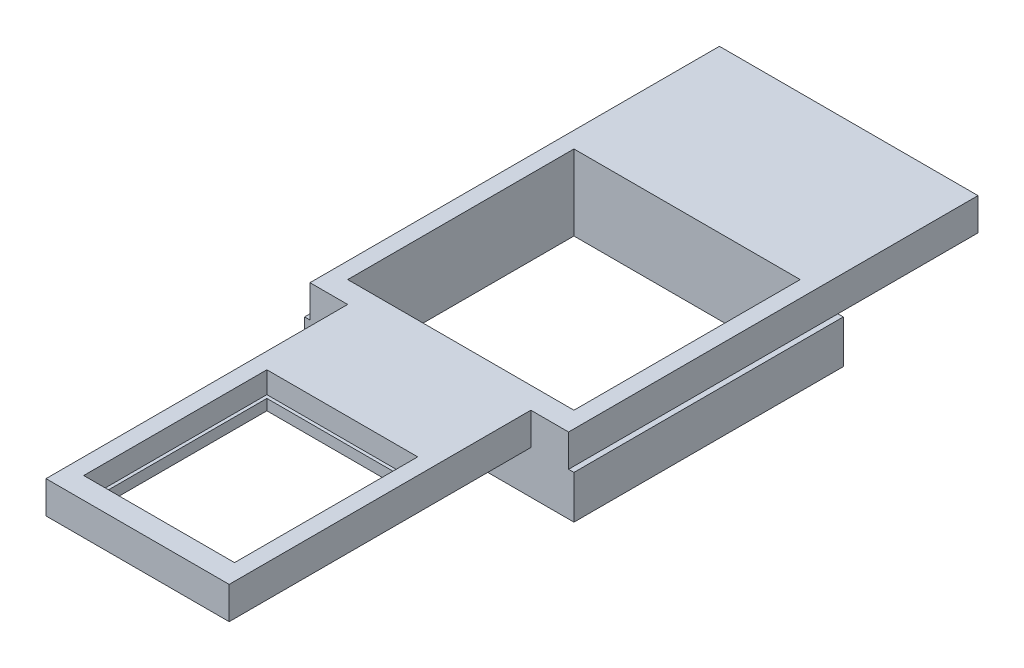
ISO-10303-21;
HEADER;
FILE_DESCRIPTION(('STEP AP214'),'2;1');
FILE_NAME('part.step','',(''),(''),'','','');
FILE_SCHEMA(('AUTOMOTIVE_DESIGN { 1 0 10303 214 1 1 1 1 }'));
ENDSEC;
DATA;
#1=APPLICATION_CONTEXT('core data for automotive mechanical design processes');
#2=APPLICATION_PROTOCOL_DEFINITION('international standard','automotive_design',2000,#1);
#3=PRODUCT_CONTEXT('',#1,'mechanical');
#4=PRODUCT('Part','Part','',(#3));
#5=PRODUCT_RELATED_PRODUCT_CATEGORY('part','',(#4));
#6=PRODUCT_DEFINITION_FORMATION('','',#4);
#7=PRODUCT_DEFINITION_CONTEXT('part definition',#1,'design');
#8=PRODUCT_DEFINITION('design','',#6,#7);
#9=PRODUCT_DEFINITION_SHAPE('','',#8);
#10=(LENGTH_UNIT() NAMED_UNIT(*) SI_UNIT(.MILLI.,.METRE.));
#11=(NAMED_UNIT(*) PLANE_ANGLE_UNIT() SI_UNIT($,.RADIAN.));
#12=(NAMED_UNIT(*) SI_UNIT($,.STERADIAN.) SOLID_ANGLE_UNIT());
#13=UNCERTAINTY_MEASURE_WITH_UNIT(LENGTH_MEASURE(1.E-05),#10,'distance_accuracy_value','');
#14=(GEOMETRIC_REPRESENTATION_CONTEXT(3) GLOBAL_UNCERTAINTY_ASSIGNED_CONTEXT((#13)) GLOBAL_UNIT_ASSIGNED_CONTEXT((#10,
#11,#12)) REPRESENTATION_CONTEXT('',''));
#15=CARTESIAN_POINT('',(0.,0.,0.));
#16=DIRECTION('',(0.,0.,1.));
#17=DIRECTION('',(1.,0.,0.));
#18=AXIS2_PLACEMENT_3D('',#15,#16,#17);
#19=CARTESIAN_POINT('',(-7.,-0.00100000000000013,21.5));
#20=DIRECTION('',(-1.,0.,0.));
#21=DIRECTION('',(0.,0.,1.));
#22=AXIS2_PLACEMENT_3D('',#19,#20,#21);
#23=PLANE('',#22);
#24=DIRECTION('',(0.,0.,-1.));
#25=VECTOR('',#24,1.);
#26=CARTESIAN_POINT('',(-7.,5.,38.5));
#27=LINE('',#26,#25);
#28=CARTESIAN_POINT('',(-7.,5.,38.5));
#29=VERTEX_POINT('',#28);
#30=CARTESIAN_POINT('',(-7.,5.,21.5));
#31=VERTEX_POINT('',#30);
#32=EDGE_CURVE('E52',#29,#31,#27,.T.);
#33=ORIENTED_EDGE('',*,*,#32,.T.);
#34=DIRECTION('',(0.,1.,0.));
#35=VECTOR('',#34,1.);
#36=CARTESIAN_POINT('',(-7.,-0.00100000000000013,21.5));
#37=LINE('',#36,#35);
#38=CARTESIAN_POINT('',(-7.,7.,21.5));
#39=VERTEX_POINT('',#38);
#40=EDGE_CURVE('E382',#31,#39,#37,.T.);
#41=ORIENTED_EDGE('',*,*,#40,.T.);
#42=DIRECTION('',(0.,0.,1.));
#43=VECTOR('',#42,1.);
#44=CARTESIAN_POINT('',(-7.,7.,21.5));
#45=LINE('',#44,#43);
#46=CARTESIAN_POINT('',(-7.,7.,38.5));
#47=VERTEX_POINT('',#46);
#48=EDGE_CURVE('E361',#39,#47,#45,.T.);
#49=ORIENTED_EDGE('',*,*,#48,.T.);
#50=DIRECTION('',(0.,1.,0.));
#51=VECTOR('',#50,1.);
#52=CARTESIAN_POINT('',(-7.,-0.00100000000000013,38.5));
#53=LINE('',#52,#51);
#54=EDGE_CURVE('E381',#29,#47,#53,.T.);
#55=ORIENTED_EDGE('',*,*,#54,.F.);
#56=EDGE_LOOP('',(#33,#41,#49,#55));
#57=FACE_BOUND('',#56,.T.);
#58=ADVANCED_FACE('F35',(#57),#23,.F.);
#59=CARTESIAN_POINT('',(-7.,-0.00100000000000013,21.5));
#60=DIRECTION('',(0.,0.,-1.));
#61=DIRECTION('',(-1.,0.,0.));
#62=AXIS2_PLACEMENT_3D('',#59,#60,#61);
#63=PLANE('',#62);
#64=DIRECTION('',(1.,0.,0.));
#65=VECTOR('',#64,1.);
#66=CARTESIAN_POINT('',(-7.,5.,21.5));
#67=LINE('',#66,#65);
#68=CARTESIAN_POINT('',(7.,5.,21.5));
#69=VERTEX_POINT('',#68);
#70=EDGE_CURVE('E59',#31,#69,#67,.T.);
#71=ORIENTED_EDGE('',*,*,#70,.T.);
#72=DIRECTION('',(0.,1.,0.));
#73=VECTOR('',#72,1.);
#74=CARTESIAN_POINT('',(7.,-0.00100000000000013,21.5));
#75=LINE('',#74,#73);
#76=CARTESIAN_POINT('',(7.,7.,21.5));
#77=VERTEX_POINT('',#76);
#78=EDGE_CURVE('E385',#69,#77,#75,.T.);
#79=ORIENTED_EDGE('',*,*,#78,.T.);
#80=DIRECTION('',(-1.,0.,0.));
#81=VECTOR('',#80,1.);
#82=CARTESIAN_POINT('',(-7.,7.,21.5));
#83=LINE('',#82,#81);
#84=EDGE_CURVE('E378',#77,#39,#83,.T.);
#85=ORIENTED_EDGE('',*,*,#84,.T.);
#86=ORIENTED_EDGE('',*,*,#40,.F.);
#87=EDGE_LOOP('',(#71,#79,#85,#86));
#88=FACE_BOUND('',#87,.T.);
#89=ADVANCED_FACE('F618',(#88),#63,.F.);
#90=CARTESIAN_POINT('',(7.,-0.00100000000000013,21.5));
#91=DIRECTION('',(1.,0.,0.));
#92=DIRECTION('',(0.,0.,-1.));
#93=AXIS2_PLACEMENT_3D('',#90,#91,#92);
#94=PLANE('',#93);
#95=DIRECTION('',(0.,0.,1.));
#96=VECTOR('',#95,1.);
#97=CARTESIAN_POINT('',(7.,5.,21.5));
#98=LINE('',#97,#96);
#99=CARTESIAN_POINT('',(7.,5.,38.5));
#100=VERTEX_POINT('',#99);
#101=EDGE_CURVE('E300',#69,#100,#98,.T.);
#102=ORIENTED_EDGE('',*,*,#101,.T.);
#103=DIRECTION('',(0.,1.,0.));
#104=VECTOR('',#103,1.);
#105=CARTESIAN_POINT('',(7.,-0.00100000000000013,38.5));
#106=LINE('',#105,#104);
#107=CARTESIAN_POINT('',(7.,7.,38.5));
#108=VERTEX_POINT('',#107);
#109=EDGE_CURVE('E387',#100,#108,#106,.T.);
#110=ORIENTED_EDGE('',*,*,#109,.T.);
#111=DIRECTION('',(0.,0.,-1.));
#112=VECTOR('',#111,1.);
#113=CARTESIAN_POINT('',(7.,7.,21.5));
#114=LINE('',#113,#112);
#115=EDGE_CURVE('E375',#108,#77,#114,.T.);
#116=ORIENTED_EDGE('',*,*,#115,.T.);
#117=ORIENTED_EDGE('',*,*,#78,.F.);
#118=EDGE_LOOP('',(#102,#110,#116,#117));
#119=FACE_BOUND('',#118,.T.);
#120=ADVANCED_FACE('F623',(#119),#94,.F.);
#121=CARTESIAN_POINT('',(-7.,-0.00100000000000013,38.5));
#122=DIRECTION('',(0.,0.,1.));
#123=DIRECTION('',(1.,0.,0.));
#124=AXIS2_PLACEMENT_3D('',#121,#122,#123);
#125=PLANE('',#124);
#126=DIRECTION('',(-1.,0.,0.));
#127=VECTOR('',#126,1.);
#128=CARTESIAN_POINT('',(7.,5.,38.5));
#129=LINE('',#128,#127);
#130=EDGE_CURVE('E293',#100,#29,#129,.T.);
#131=ORIENTED_EDGE('',*,*,#130,.T.);
#132=ORIENTED_EDGE('',*,*,#54,.T.);
#133=DIRECTION('',(1.,0.,0.));
#134=VECTOR('',#133,1.);
#135=CARTESIAN_POINT('',(-7.,7.,38.5));
#136=LINE('',#135,#134);
#137=EDGE_CURVE('E372',#47,#108,#136,.T.);
#138=ORIENTED_EDGE('',*,*,#137,.T.);
#139=ORIENTED_EDGE('',*,*,#109,.F.);
#140=EDGE_LOOP('',(#131,#132,#138,#139));
#141=FACE_BOUND('',#140,.T.);
#142=ADVANCED_FACE('F627',(#141),#125,.F.);
#143=CARTESIAN_POINT('',(-10.,4.,7.62616456257873));
#144=DIRECTION('',(-1.,0.,0.));
#145=DIRECTION('',(0.,-1.,0.));
#146=AXIS2_PLACEMENT_3D('',#143,#144,#145);
#147=PLANE('',#146);
#148=DIRECTION('',(0.,0.,-1.));
#149=VECTOR('',#148,1.);
#150=CARTESIAN_POINT('',(-10.,6.25,7.62616456257873));
#151=LINE('',#150,#149);
#152=CARTESIAN_POINT('',(-10.,6.25,-19.5));
#153=VERTEX_POINT('',#152);
#154=CARTESIAN_POINT('',(-10.,6.25,-24.5));
#155=VERTEX_POINT('',#154);
#156=EDGE_CURVE('E567',#153,#155,#151,.T.);
#157=ORIENTED_EDGE('',*,*,#156,.F.);
#158=DIRECTION('',(0.,1.,0.));
#159=VECTOR('',#158,1.);
#160=CARTESIAN_POINT('',(-10.,3.99999999999997,-19.5));
#161=LINE('',#160,#159);
#162=CARTESIAN_POINT('',(-10.,4.,-19.5));
#163=VERTEX_POINT('',#162);
#164=EDGE_CURVE('E339',#163,#153,#161,.T.);
#165=ORIENTED_EDGE('',*,*,#164,.F.);
#166=DIRECTION('',(0.,0.,-1.));
#167=VECTOR('',#166,1.);
#168=CARTESIAN_POINT('',(-10.,4.,7.62616456257873));
#169=LINE('',#168,#167);
#170=CARTESIAN_POINT('',(-10.,4.,-24.5));
#171=VERTEX_POINT('',#170);
#172=EDGE_CURVE('E563',#163,#171,#169,.T.);
#173=ORIENTED_EDGE('',*,*,#172,.T.);
#174=DIRECTION('',(0.,-1.,0.));
#175=VECTOR('',#174,1.);
#176=CARTESIAN_POINT('',(-10.,6.25,-24.5));
#177=LINE('',#176,#175);
#178=EDGE_CURVE('E358',#155,#171,#177,.T.);
#179=ORIENTED_EDGE('',*,*,#178,.F.);
#180=EDGE_LOOP('',(#157,#165,#173,#179));
#181=FACE_BOUND('',#180,.T.);
#182=ADVANCED_FACE('F577',(#181),#147,.F.);
#183=CARTESIAN_POINT('',(0.,4.,0.));
#184=DIRECTION('',(0.,1.,0.));
#185=DIRECTION('',(0.,0.,1.));
#186=AXIS2_PLACEMENT_3D('',#183,#184,#185);
#187=PLANE('',#186);
#188=ORIENTED_EDGE('',*,*,#172,.F.);
#189=DIRECTION('',(-1.,0.,0.));
#190=VECTOR('',#189,1.);
#191=CARTESIAN_POINT('',(12.501025,4.,-19.5));
#192=LINE('',#191,#190);
#193=CARTESIAN_POINT('',(-12.,4.,-19.5));
#194=VERTEX_POINT('',#193);
#195=EDGE_CURVE('E335',#163,#194,#192,.T.);
#196=ORIENTED_EDGE('',*,*,#195,.T.);
#197=DIRECTION('',(0.,0.,1.));
#198=VECTOR('',#197,1.);
#199=CARTESIAN_POINT('',(-12.,4.,-25.5));
#200=LINE('',#199,#198);
#201=CARTESIAN_POINT('',(-12.,4.,-25.5));
#202=VERTEX_POINT('',#201);
#203=EDGE_CURVE('E445',#202,#194,#200,.T.);
#204=ORIENTED_EDGE('',*,*,#203,.F.);
#205=DIRECTION('',(-1.,0.,0.));
#206=VECTOR('',#205,1.);
#207=CARTESIAN_POINT('',(-12.,4.,-25.5));
#208=LINE('',#207,#206);
#209=CARTESIAN_POINT('',(12.,4.,-25.5));
#210=VERTEX_POINT('',#209);
#211=EDGE_CURVE('E461',#210,#202,#208,.T.);
#212=ORIENTED_EDGE('',*,*,#211,.F.);
#213=DIRECTION('',(0.,0.,-1.));
#214=VECTOR('',#213,1.);
#215=CARTESIAN_POINT('',(12.,4.,-25.5));
#216=LINE('',#215,#214);
#217=CARTESIAN_POINT('',(12.,4.,-12.5));
#218=VERTEX_POINT('',#217);
#219=EDGE_CURVE('E449',#218,#210,#216,.T.);
#220=ORIENTED_EDGE('',*,*,#219,.F.);
#221=DIRECTION('',(-1.,0.,0.));
#222=VECTOR('',#221,1.);
#223=CARTESIAN_POINT('',(-12.5,4.,-12.5));
#224=LINE('',#223,#222);
#225=CARTESIAN_POINT('',(10.,4.,-12.5));
#226=VERTEX_POINT('',#225);
#227=EDGE_CURVE('E511',#218,#226,#224,.T.);
#228=ORIENTED_EDGE('',*,*,#227,.T.);
#229=DIRECTION('',(0.,0.,-1.));
#230=VECTOR('',#229,1.);
#231=CARTESIAN_POINT('',(10.,4.,7.62616456257873));
#232=LINE('',#231,#230);
#233=CARTESIAN_POINT('',(10.0000000001046,4.00000000000003,-24.5));
#234=VERTEX_POINT('',#233);
#235=EDGE_CURVE('E548',#226,#234,#232,.T.);
#236=ORIENTED_EDGE('',*,*,#235,.T.);
#237=DIRECTION('',(-1.,0.,0.));
#238=VECTOR('',#237,1.);
#239=CARTESIAN_POINT('',(500000.,4.00000000077101,-24.5000000000723));
#240=LINE('',#239,#238);
#241=EDGE_CURVE('E362',#234,#171,#240,.T.);
#242=ORIENTED_EDGE('',*,*,#241,.T.);
#243=EDGE_LOOP('',(#188,#196,#204,#212,#220,#228,#236,#242));
#244=FACE_BOUND('',#243,.T.);
#245=ADVANCED_FACE('F546',(#244),#187,.F.);
#246=CARTESIAN_POINT('',(-10.,4.,-12.5));
#247=VERTEX_POINT('',#246);
#248=CARTESIAN_POINT('',(-10.,4.,-17.5));
#249=VERTEX_POINT('',#248);
#250=EDGE_CURVE('E559',#247,#249,#169,.T.);
#251=ORIENTED_EDGE('',*,*,#250,.T.);
#252=DIRECTION('',(0.,-1.,0.));
#253=VECTOR('',#252,1.);
#254=CARTESIAN_POINT('',(-10.,3.99999999999997,-17.5));
#255=LINE('',#254,#253);
#256=CARTESIAN_POINT('',(-10.,6.25,-17.5));
#257=VERTEX_POINT('',#256);
#258=EDGE_CURVE('E348',#257,#249,#255,.T.);
#259=ORIENTED_EDGE('',*,*,#258,.F.);
#260=CARTESIAN_POINT('',(-10.,6.25,-12.5));
#261=VERTEX_POINT('',#260);
#262=EDGE_CURVE('E564',#261,#257,#151,.T.);
#263=ORIENTED_EDGE('',*,*,#262,.F.);
#264=DIRECTION('',(0.,1.,0.));
#265=VECTOR('',#264,1.);
#266=CARTESIAN_POINT('',(-10.,4.,-12.5));
#267=LINE('',#266,#265);
#268=EDGE_CURVE('E562',#247,#261,#267,.T.);
#269=ORIENTED_EDGE('',*,*,#268,.F.);
#270=EDGE_LOOP('',(#251,#259,#263,#269));
#271=FACE_BOUND('',#270,.T.);
#272=ADVANCED_FACE('F647',(#271),#147,.F.);
#273=CARTESIAN_POINT('',(10.,6.25,7.62616456257873));
#274=DIRECTION('',(0.,1.,0.));
#275=DIRECTION('',(-1.,0.,0.));
#276=AXIS2_PLACEMENT_3D('',#273,#274,#275);
#277=PLANE('',#276);
#278=DIRECTION('',(-1.,0.,0.));
#279=VECTOR('',#278,1.);
#280=CARTESIAN_POINT('',(500000.,6.25000000077101,-24.5000000000723));
#281=LINE('',#280,#279);
#282=CARTESIAN_POINT('',(10.0000000001046,6.25000000000003,-24.5));
#283=VERTEX_POINT('',#282);
#284=EDGE_CURVE('E363',#283,#155,#281,.T.);
#285=ORIENTED_EDGE('',*,*,#284,.F.);
#286=DIRECTION('',(0.,0.,-1.));
#287=VECTOR('',#286,1.);
#288=CARTESIAN_POINT('',(10.,6.25,7.62616456257873));
#289=LINE('',#288,#287);
#290=CARTESIAN_POINT('',(10.,6.25,-12.5));
#291=VERTEX_POINT('',#290);
#292=EDGE_CURVE('E555',#291,#283,#289,.T.);
#293=ORIENTED_EDGE('',*,*,#292,.F.);
#294=DIRECTION('',(1.,0.,0.));
#295=VECTOR('',#294,1.);
#296=CARTESIAN_POINT('',(10.,6.25,-12.5));
#297=LINE('',#296,#295);
#298=EDGE_CURVE('E551',#261,#291,#297,.T.);
#299=ORIENTED_EDGE('',*,*,#298,.F.);
#300=ORIENTED_EDGE('',*,*,#262,.T.);
#301=DIRECTION('',(-1.,0.,0.));
#302=VECTOR('',#301,1.);
#303=CARTESIAN_POINT('',(12.501025,6.25,-17.5));
#304=LINE('',#303,#302);
#305=CARTESIAN_POINT('',(-12.,6.25,-17.5));
#306=VERTEX_POINT('',#305);
#307=EDGE_CURVE('E353',#257,#306,#304,.T.);
#308=ORIENTED_EDGE('',*,*,#307,.T.);
#309=DIRECTION('',(0.,0.,-1.));
#310=VECTOR('',#309,1.);
#311=CARTESIAN_POINT('',(-12.,6.25,-19.5));
#312=LINE('',#311,#310);
#313=CARTESIAN_POINT('',(-12.,6.25,-19.5));
#314=VERTEX_POINT('',#313);
#315=EDGE_CURVE('E336',#306,#314,#312,.T.);
#316=ORIENTED_EDGE('',*,*,#315,.T.);
#317=DIRECTION('',(-1.,0.,0.));
#318=VECTOR('',#317,1.);
#319=CARTESIAN_POINT('',(12.501025,6.25,-19.5));
#320=LINE('',#319,#318);
#321=EDGE_CURVE('E351',#153,#314,#320,.T.);
#322=ORIENTED_EDGE('',*,*,#321,.F.);
#323=ORIENTED_EDGE('',*,*,#156,.T.);
#324=EDGE_LOOP('',(#285,#293,#299,#300,#308,#316,#322,#323));
#325=FACE_BOUND('',#324,.T.);
#326=ADVANCED_FACE('F582',(#325),#277,.F.);
#327=CARTESIAN_POINT('',(10.,4.,7.62616456257873));
#328=DIRECTION('',(1.,0.,0.));
#329=DIRECTION('',(0.,1.,0.));
#330=AXIS2_PLACEMENT_3D('',#327,#328,#329);
#331=PLANE('',#330);
#332=DIRECTION('',(0.,-1.,0.));
#333=VECTOR('',#332,1.);
#334=CARTESIAN_POINT('',(9.99999999999091,6.25000000154198,-24.5));
#335=LINE('',#334,#333);
#336=EDGE_CURVE('E350',#283,#234,#335,.T.);
#337=ORIENTED_EDGE('',*,*,#336,.T.);
#338=ORIENTED_EDGE('',*,*,#235,.F.);
#339=DIRECTION('',(0.,-1.,0.));
#340=VECTOR('',#339,1.);
#341=CARTESIAN_POINT('',(10.,4.,-12.5));
#342=LINE('',#341,#340);
#343=EDGE_CURVE('E550',#291,#226,#342,.T.);
#344=ORIENTED_EDGE('',*,*,#343,.F.);
#345=ORIENTED_EDGE('',*,*,#292,.T.);
#346=EDGE_LOOP('',(#337,#338,#344,#345));
#347=FACE_BOUND('',#346,.T.);
#348=ADVANCED_FACE('F557',(#347),#331,.F.);
#349=CARTESIAN_POINT('',(-12.5,4.,12.5));
#350=DIRECTION('',(0.,0.,-1.));
#351=DIRECTION('',(-1.,0.,0.));
#352=AXIS2_PLACEMENT_3D('',#349,#350,#351);
#353=PLANE('',#352);
#354=DIRECTION('',(0.,-1.,0.));
#355=VECTOR('',#354,1.);
#356=CARTESIAN_POINT('',(-8.5,7.,12.5));
#357=LINE('',#356,#355);
#358=CARTESIAN_POINT('',(-8.5,7.,12.5));
#359=VERTEX_POINT('',#358);
#360=CARTESIAN_POINT('',(-8.5,4.,12.5));
#361=VERTEX_POINT('',#360);
#362=EDGE_CURVE('E384',#359,#361,#357,.T.);
#363=ORIENTED_EDGE('',*,*,#362,.F.);
#364=DIRECTION('',(1.,0.,0.));
#365=VECTOR('',#364,1.);
#366=CARTESIAN_POINT('',(-12.,7.,12.5));
#367=LINE('',#366,#365);
#368=CARTESIAN_POINT('',(-12.,7.,12.5));
#369=VERTEX_POINT('',#368);
#370=EDGE_CURVE('E432',#369,#359,#367,.T.);
#371=ORIENTED_EDGE('',*,*,#370,.F.);
#372=DIRECTION('',(0.,-1.,0.));
#373=VECTOR('',#372,1.);
#374=CARTESIAN_POINT('',(-12.,7.,12.5));
#375=LINE('',#374,#373);
#376=CARTESIAN_POINT('',(-12.,4.,12.5));
#377=VERTEX_POINT('',#376);
#378=EDGE_CURVE('E465',#369,#377,#375,.T.);
#379=ORIENTED_EDGE('',*,*,#378,.T.);
#380=DIRECTION('',(1.,0.,0.));
#381=VECTOR('',#380,1.);
#382=CARTESIAN_POINT('',(-12.5,4.,12.5));
#383=LINE('',#382,#381);
#384=CARTESIAN_POINT('',(-12.5,4.,12.5));
#385=VERTEX_POINT('',#384);
#386=EDGE_CURVE('E494',#385,#377,#383,.T.);
#387=ORIENTED_EDGE('',*,*,#386,.F.);
#388=DIRECTION('',(0.,-1.,0.));
#389=VECTOR('',#388,1.);
#390=CARTESIAN_POINT('',(-12.5,4.,12.5));
#391=LINE('',#390,#389);
#392=CARTESIAN_POINT('',(-12.5,0.,12.5));
#393=VERTEX_POINT('',#392);
#394=EDGE_CURVE('E493',#385,#393,#391,.T.);
#395=ORIENTED_EDGE('',*,*,#394,.T.);
#396=DIRECTION('',(1.,0.,0.));
#397=VECTOR('',#396,1.);
#398=CARTESIAN_POINT('',(-12.5,0.,12.5));
#399=LINE('',#398,#397);
#400=CARTESIAN_POINT('',(12.5,0.,12.5));
#401=VERTEX_POINT('',#400);
#402=EDGE_CURVE('E488',#393,#401,#399,.T.);
#403=ORIENTED_EDGE('',*,*,#402,.T.);
#404=DIRECTION('',(0.,-1.,0.));
#405=VECTOR('',#404,1.);
#406=CARTESIAN_POINT('',(12.5,4.,12.5));
#407=LINE('',#406,#405);
#408=CARTESIAN_POINT('',(12.5,4.,12.5));
#409=VERTEX_POINT('',#408);
#410=EDGE_CURVE('E491',#409,#401,#407,.T.);
#411=ORIENTED_EDGE('',*,*,#410,.F.);
#412=CARTESIAN_POINT('',(12.,4.,12.5));
#413=VERTEX_POINT('',#412);
#414=EDGE_CURVE('E455',#413,#409,#383,.T.);
#415=ORIENTED_EDGE('',*,*,#414,.F.);
#416=DIRECTION('',(0.,-1.,0.));
#417=VECTOR('',#416,1.);
#418=CARTESIAN_POINT('',(12.,7.,12.5));
#419=LINE('',#418,#417);
#420=CARTESIAN_POINT('',(12.,7.,12.5));
#421=VERTEX_POINT('',#420);
#422=EDGE_CURVE('E462',#421,#413,#419,.T.);
#423=ORIENTED_EDGE('',*,*,#422,.F.);
#424=CARTESIAN_POINT('',(8.5,7.,12.5));
#425=VERTEX_POINT('',#424);
#426=EDGE_CURVE('E429',#425,#421,#367,.T.);
#427=ORIENTED_EDGE('',*,*,#426,.F.);
#428=DIRECTION('',(0.,1.,0.));
#429=VECTOR('',#428,1.);
#430=CARTESIAN_POINT('',(8.5,7.,12.5));
#431=LINE('',#430,#429);
#432=CARTESIAN_POINT('',(8.5,4.,12.5));
#433=VERTEX_POINT('',#432);
#434=EDGE_CURVE('E394',#433,#425,#431,.T.);
#435=ORIENTED_EDGE('',*,*,#434,.F.);
#436=DIRECTION('',(1.,0.,0.));
#437=VECTOR('',#436,1.);
#438=CARTESIAN_POINT('',(-8.5,4.,12.5));
#439=LINE('',#438,#437);
#440=EDGE_CURVE('E401',#361,#433,#439,.T.);
#441=ORIENTED_EDGE('',*,*,#440,.F.);
#442=EDGE_LOOP('',(#363,#371,#379,#387,#395,#403,#411,#415,#423,#427,#435,#441));
#443=FACE_BOUND('',#442,.T.);
#444=ADVANCED_FACE('F595',(#443),#353,.F.);
#445=CARTESIAN_POINT('',(0.,4.,0.));
#446=DIRECTION('',(0.,-1.,0.));
#447=DIRECTION('',(0.,0.,-1.));
#448=AXIS2_PLACEMENT_3D('',#445,#446,#447);
#449=PLANE('',#448);
#450=CARTESIAN_POINT('',(-12.,4.,-12.5));
#451=VERTEX_POINT('',#450);
#452=EDGE_CURVE('E11',#451,#377,#200,.T.);
#453=ORIENTED_EDGE('',*,*,#452,.F.);
#454=CARTESIAN_POINT('',(-12.5,4.,-12.5));
#455=VERTEX_POINT('',#454);
#456=EDGE_CURVE('E516',#451,#455,#224,.T.);
#457=ORIENTED_EDGE('',*,*,#456,.T.);
#458=DIRECTION('',(0.,0.,1.));
#459=VECTOR('',#458,1.);
#460=CARTESIAN_POINT('',(-12.5,4.,12.5));
#461=LINE('',#460,#459);
#462=EDGE_CURVE('E503',#455,#385,#461,.T.);
#463=ORIENTED_EDGE('',*,*,#462,.T.);
#464=ORIENTED_EDGE('',*,*,#386,.T.);
#465=EDGE_LOOP('',(#453,#457,#463,#464));
#466=FACE_BOUND('',#465,.T.);
#467=ADVANCED_FACE('F534',(#466),#449,.F.);
#468=EDGE_CURVE('E458',#413,#218,#216,.T.);
#469=ORIENTED_EDGE('',*,*,#468,.F.);
#470=ORIENTED_EDGE('',*,*,#414,.T.);
#471=DIRECTION('',(0.,0.,-1.));
#472=VECTOR('',#471,1.);
#473=CARTESIAN_POINT('',(12.5,4.,12.5));
#474=LINE('',#473,#472);
#475=CARTESIAN_POINT('',(12.5,4.,-12.5));
#476=VERTEX_POINT('',#475);
#477=EDGE_CURVE('E490',#409,#476,#474,.T.);
#478=ORIENTED_EDGE('',*,*,#477,.T.);
#479=EDGE_CURVE('E508',#476,#218,#224,.T.);
#480=ORIENTED_EDGE('',*,*,#479,.T.);
#481=EDGE_LOOP('',(#469,#470,#478,#480));
#482=FACE_BOUND('',#481,.T.);
#483=ADVANCED_FACE('F594',(#482),#449,.F.);
#484=CARTESIAN_POINT('',(12.5,4.,12.5));
#485=DIRECTION('',(-1.,0.,0.));
#486=DIRECTION('',(0.,0.,1.));
#487=AXIS2_PLACEMENT_3D('',#484,#485,#486);
#488=PLANE('',#487);
#489=DIRECTION('',(0.,0.,-1.));
#490=VECTOR('',#489,1.);
#491=CARTESIAN_POINT('',(12.5,0.,12.5));
#492=LINE('',#491,#490);
#493=CARTESIAN_POINT('',(12.5,0.,-12.5));
#494=VERTEX_POINT('',#493);
#495=EDGE_CURVE('E470',#401,#494,#492,.T.);
#496=ORIENTED_EDGE('',*,*,#495,.T.);
#497=DIRECTION('',(0.,-1.,0.));
#498=VECTOR('',#497,1.);
#499=CARTESIAN_POINT('',(12.5,4.,-12.5));
#500=LINE('',#499,#498);
#501=EDGE_CURVE('E44',#476,#494,#500,.T.);
#502=ORIENTED_EDGE('',*,*,#501,.F.);
#503=ORIENTED_EDGE('',*,*,#477,.F.);
#504=ORIENTED_EDGE('',*,*,#410,.T.);
#505=EDGE_LOOP('',(#496,#502,#503,#504));
#506=FACE_BOUND('',#505,.T.);
#507=ADVANCED_FACE('F37',(#506),#488,.F.);
#508=CARTESIAN_POINT('',(-12.5,4.,-12.5));
#509=DIRECTION('',(0.,0.,1.));
#510=DIRECTION('',(1.,0.,0.));
#511=AXIS2_PLACEMENT_3D('',#508,#509,#510);
#512=PLANE('',#511);
#513=DIRECTION('',(-1.,0.,0.));
#514=VECTOR('',#513,1.);
#515=CARTESIAN_POINT('',(-12.5,0.,-12.5));
#516=LINE('',#515,#514);
#517=CARTESIAN_POINT('',(-12.5,0.,-12.5));
#518=VERTEX_POINT('',#517);
#519=EDGE_CURVE('E476',#494,#518,#516,.T.);
#520=ORIENTED_EDGE('',*,*,#519,.T.);
#521=DIRECTION('',(0.,-1.,0.));
#522=VECTOR('',#521,1.);
#523=CARTESIAN_POINT('',(-12.5,4.,-12.5));
#524=LINE('',#523,#522);
#525=EDGE_CURVE('E497',#455,#518,#524,.T.);
#526=ORIENTED_EDGE('',*,*,#525,.F.);
#527=ORIENTED_EDGE('',*,*,#456,.F.);
#528=EDGE_CURVE('E513',#247,#451,#224,.T.);
#529=ORIENTED_EDGE('',*,*,#528,.F.);
#530=ORIENTED_EDGE('',*,*,#268,.T.);
#531=ORIENTED_EDGE('',*,*,#298,.T.);
#532=ORIENTED_EDGE('',*,*,#343,.T.);
#533=ORIENTED_EDGE('',*,*,#227,.F.);
#534=ORIENTED_EDGE('',*,*,#479,.F.);
#535=ORIENTED_EDGE('',*,*,#501,.T.);
#536=EDGE_LOOP('',(#520,#526,#527,#529,#530,#531,#532,#533,#534,#535));
#537=FACE_BOUND('',#536,.T.);
#538=ADVANCED_FACE('F538',(#537),#512,.F.);
#539=CARTESIAN_POINT('',(-12.5,4.,12.5));
#540=DIRECTION('',(1.,0.,0.));
#541=DIRECTION('',(0.,0.,-1.));
#542=AXIS2_PLACEMENT_3D('',#539,#540,#541);
#543=PLANE('',#542);
#544=DIRECTION('',(0.,0.,1.));
#545=VECTOR('',#544,1.);
#546=CARTESIAN_POINT('',(-12.5,0.,12.5));
#547=LINE('',#546,#545);
#548=EDGE_CURVE('E482',#518,#393,#547,.T.);
#549=ORIENTED_EDGE('',*,*,#548,.T.);
#550=ORIENTED_EDGE('',*,*,#394,.F.);
#551=ORIENTED_EDGE('',*,*,#462,.F.);
#552=ORIENTED_EDGE('',*,*,#525,.T.);
#553=EDGE_LOOP('',(#549,#550,#551,#552));
#554=FACE_BOUND('',#553,.T.);
#555=ADVANCED_FACE('F601',(#554),#543,.F.);
#556=CARTESIAN_POINT('',(0.,0.,0.));
#557=DIRECTION('',(0.,-1.,0.));
#558=DIRECTION('',(0.,0.,-1.));
#559=AXIS2_PLACEMENT_3D('',#556,#557,#558);
#560=PLANE('',#559);
#561=DIRECTION('',(1.,0.,0.));
#562=VECTOR('',#561,1.);
#563=CARTESIAN_POINT('',(-10.5,0.,-10.5));
#564=LINE('',#563,#562);
#565=CARTESIAN_POINT('',(-10.5,0.,-10.5));
#566=VERTEX_POINT('',#565);
#567=CARTESIAN_POINT('',(10.5,0.,-10.5));
#568=VERTEX_POINT('',#567);
#569=EDGE_CURVE('E312',#566,#568,#564,.T.);
#570=ORIENTED_EDGE('',*,*,#569,.F.);
#571=DIRECTION('',(0.,0.,-1.));
#572=VECTOR('',#571,1.);
#573=CARTESIAN_POINT('',(-10.5,0.,10.5));
#574=LINE('',#573,#572);
#575=CARTESIAN_POINT('',(-10.5,0.,10.5));
#576=VERTEX_POINT('',#575);
#577=EDGE_CURVE('E320',#576,#566,#574,.T.);
#578=ORIENTED_EDGE('',*,*,#577,.F.);
#579=DIRECTION('',(-1.,0.,0.));
#580=VECTOR('',#579,1.);
#581=CARTESIAN_POINT('',(10.5,0.,10.5));
#582=LINE('',#581,#580);
#583=CARTESIAN_POINT('',(10.5,0.,10.5));
#584=VERTEX_POINT('',#583);
#585=EDGE_CURVE('E317',#584,#576,#582,.T.);
#586=ORIENTED_EDGE('',*,*,#585,.F.);
#587=DIRECTION('',(0.,0.,1.));
#588=VECTOR('',#587,1.);
#589=CARTESIAN_POINT('',(10.5,0.,-10.5));
#590=LINE('',#589,#588);
#591=EDGE_CURVE('E314',#568,#584,#590,.T.);
#592=ORIENTED_EDGE('',*,*,#591,.F.);
#593=EDGE_LOOP('',(#570,#578,#586,#592));
#594=FACE_BOUND('',#593,.T.);
#595=ORIENTED_EDGE('',*,*,#495,.F.);
#596=ORIENTED_EDGE('',*,*,#402,.F.);
#597=ORIENTED_EDGE('',*,*,#548,.F.);
#598=ORIENTED_EDGE('',*,*,#519,.F.);
#599=EDGE_LOOP('',(#595,#596,#597,#598));
#600=FACE_BOUND('',#599,.T.);
#601=ADVANCED_FACE('F602',(#594,#600),#560,.T.);
#602=CARTESIAN_POINT('',(-12.,4.,-17.5));
#603=VERTEX_POINT('',#602);
#604=EDGE_CURVE('E450',#603,#451,#200,.T.);
#605=ORIENTED_EDGE('',*,*,#604,.F.);
#606=DIRECTION('',(-1.,0.,0.));
#607=VECTOR('',#606,1.);
#608=CARTESIAN_POINT('',(12.501025,4.,-17.5));
#609=LINE('',#608,#607);
#610=EDGE_CURVE('E345',#249,#603,#609,.T.);
#611=ORIENTED_EDGE('',*,*,#610,.F.);
#612=ORIENTED_EDGE('',*,*,#250,.F.);
#613=ORIENTED_EDGE('',*,*,#528,.T.);
#614=EDGE_LOOP('',(#605,#611,#612,#613));
#615=FACE_BOUND('',#614,.T.);
#616=ADVANCED_FACE('F604',(#615),#187,.F.);
#617=CARTESIAN_POINT('',(-12.,7.,-25.5));
#618=DIRECTION('',(1.,0.,0.));
#619=DIRECTION('',(0.,0.,-1.));
#620=AXIS2_PLACEMENT_3D('',#617,#618,#619);
#621=PLANE('',#620);
#622=ORIENTED_EDGE('',*,*,#203,.T.);
#623=DIRECTION('',(0.,-1.,0.));
#624=VECTOR('',#623,1.);
#625=CARTESIAN_POINT('',(-12.,4.,-19.5));
#626=LINE('',#625,#624);
#627=EDGE_CURVE('E343',#314,#194,#626,.T.);
#628=ORIENTED_EDGE('',*,*,#627,.F.);
#629=ORIENTED_EDGE('',*,*,#315,.F.);
#630=DIRECTION('',(0.,1.,0.));
#631=VECTOR('',#630,1.);
#632=CARTESIAN_POINT('',(-12.,4.,-17.5));
#633=LINE('',#632,#631);
#634=EDGE_CURVE('E340',#603,#306,#633,.T.);
#635=ORIENTED_EDGE('',*,*,#634,.F.);
#636=ORIENTED_EDGE('',*,*,#604,.T.);
#637=ORIENTED_EDGE('',*,*,#452,.T.);
#638=ORIENTED_EDGE('',*,*,#378,.F.);
#639=DIRECTION('',(0.,0.,1.));
#640=VECTOR('',#639,1.);
#641=CARTESIAN_POINT('',(-12.,7.,-25.5));
#642=LINE('',#641,#640);
#643=CARTESIAN_POINT('',(-12.,7.,-25.5));
#644=VERTEX_POINT('',#643);
#645=EDGE_CURVE('E433',#644,#369,#642,.T.);
#646=ORIENTED_EDGE('',*,*,#645,.F.);
#647=DIRECTION('',(0.,-1.,0.));
#648=VECTOR('',#647,1.);
#649=CARTESIAN_POINT('',(-12.,7.,-25.5));
#650=LINE('',#649,#648);
#651=EDGE_CURVE('E444',#644,#202,#650,.T.);
#652=ORIENTED_EDGE('',*,*,#651,.T.);
#653=EDGE_LOOP('',(#622,#628,#629,#635,#636,#637,#638,#646,#652));
#654=FACE_BOUND('',#653,.T.);
#655=ADVANCED_FACE('F529',(#654),#621,.F.);
#656=CARTESIAN_POINT('',(12.,7.,-25.5));
#657=DIRECTION('',(-1.,0.,0.));
#658=DIRECTION('',(0.,0.,1.));
#659=AXIS2_PLACEMENT_3D('',#656,#657,#658);
#660=PLANE('',#659);
#661=ORIENTED_EDGE('',*,*,#468,.T.);
#662=ORIENTED_EDGE('',*,*,#219,.T.);
#663=DIRECTION('',(0.,-1.,0.));
#664=VECTOR('',#663,1.);
#665=CARTESIAN_POINT('',(12.,7.,-25.5));
#666=LINE('',#665,#664);
#667=CARTESIAN_POINT('',(12.,7.,-25.5));
#668=VERTEX_POINT('',#667);
#669=EDGE_CURVE('E466',#668,#210,#666,.T.);
#670=ORIENTED_EDGE('',*,*,#669,.F.);
#671=DIRECTION('',(0.,0.,-1.));
#672=VECTOR('',#671,1.);
#673=CARTESIAN_POINT('',(12.,7.,-25.5));
#674=LINE('',#673,#672);
#675=EDGE_CURVE('E439',#421,#668,#674,.T.);
#676=ORIENTED_EDGE('',*,*,#675,.F.);
#677=ORIENTED_EDGE('',*,*,#422,.T.);
#678=EDGE_LOOP('',(#661,#662,#670,#676,#677));
#679=FACE_BOUND('',#678,.T.);
#680=ADVANCED_FACE('F592',(#679),#660,.F.);
#681=CARTESIAN_POINT('',(-12.,7.,-25.5));
#682=DIRECTION('',(0.,0.,1.));
#683=DIRECTION('',(1.,0.,0.));
#684=AXIS2_PLACEMENT_3D('',#681,#682,#683);
#685=PLANE('',#684);
#686=ORIENTED_EDGE('',*,*,#211,.T.);
#687=ORIENTED_EDGE('',*,*,#651,.F.);
#688=DIRECTION('',(-1.,0.,0.));
#689=VECTOR('',#688,1.);
#690=CARTESIAN_POINT('',(-12.,7.,-25.5));
#691=LINE('',#690,#689);
#692=EDGE_CURVE('E442',#668,#644,#691,.T.);
#693=ORIENTED_EDGE('',*,*,#692,.F.);
#694=ORIENTED_EDGE('',*,*,#669,.T.);
#695=EDGE_LOOP('',(#686,#687,#693,#694));
#696=FACE_BOUND('',#695,.T.);
#697=ADVANCED_FACE('F588',(#696),#685,.F.);
#698=CARTESIAN_POINT('',(0.,7.,0.));
#699=DIRECTION('',(0.,1.,0.));
#700=DIRECTION('',(0.,0.,1.));
#701=AXIS2_PLACEMENT_3D('',#698,#699,#700);
#702=PLANE('',#701);
#703=DIRECTION('',(1.,0.,0.));
#704=VECTOR('',#703,1.);
#705=CARTESIAN_POINT('',(-10.5,7.,-10.5));
#706=LINE('',#705,#704);
#707=CARTESIAN_POINT('',(-10.5,7.,-10.5));
#708=VERTEX_POINT('',#707);
#709=CARTESIAN_POINT('',(10.5,7.,-10.5));
#710=VERTEX_POINT('',#709);
#711=EDGE_CURVE('E309',#708,#710,#706,.T.);
#712=ORIENTED_EDGE('',*,*,#711,.T.);
#713=DIRECTION('',(0.,0.,1.));
#714=VECTOR('',#713,1.);
#715=CARTESIAN_POINT('',(10.5,7.,-10.5));
#716=LINE('',#715,#714);
#717=CARTESIAN_POINT('',(10.5,7.,10.5));
#718=VERTEX_POINT('',#717);
#719=EDGE_CURVE('E326',#710,#718,#716,.T.);
#720=ORIENTED_EDGE('',*,*,#719,.T.);
#721=DIRECTION('',(-1.,0.,0.));
#722=VECTOR('',#721,1.);
#723=CARTESIAN_POINT('',(10.5,7.,10.5));
#724=LINE('',#723,#722);
#725=CARTESIAN_POINT('',(-10.5,7.,10.5));
#726=VERTEX_POINT('',#725);
#727=EDGE_CURVE('E303',#718,#726,#724,.T.);
#728=ORIENTED_EDGE('',*,*,#727,.T.);
#729=DIRECTION('',(0.,0.,-1.));
#730=VECTOR('',#729,1.);
#731=CARTESIAN_POINT('',(-10.5,7.,10.5));
#732=LINE('',#731,#730);
#733=EDGE_CURVE('E306',#726,#708,#732,.T.);
#734=ORIENTED_EDGE('',*,*,#733,.T.);
#735=EDGE_LOOP('',(#712,#720,#728,#734));
#736=FACE_BOUND('',#735,.T.);
#737=ORIENTED_EDGE('',*,*,#48,.F.);
#738=ORIENTED_EDGE('',*,*,#84,.F.);
#739=ORIENTED_EDGE('',*,*,#115,.F.);
#740=ORIENTED_EDGE('',*,*,#137,.F.);
#741=EDGE_LOOP('',(#737,#738,#739,#740));
#742=FACE_BOUND('',#741,.T.);
#743=ORIENTED_EDGE('',*,*,#645,.T.);
#744=ORIENTED_EDGE('',*,*,#370,.T.);
#745=DIRECTION('',(0.,0.,-1.));
#746=VECTOR('',#745,1.);
#747=CARTESIAN_POINT('',(-8.5,7.,40.5));
#748=LINE('',#747,#746);
#749=CARTESIAN_POINT('',(-8.5,7.,40.5));
#750=VERTEX_POINT('',#749);
#751=EDGE_CURVE('E400',#750,#359,#748,.T.);
#752=ORIENTED_EDGE('',*,*,#751,.F.);
#753=DIRECTION('',(-1.,0.,0.));
#754=VECTOR('',#753,1.);
#755=CARTESIAN_POINT('',(-8.5,7.,40.5));
#756=LINE('',#755,#754);
#757=CARTESIAN_POINT('',(8.5,7.,40.5));
#758=VERTEX_POINT('',#757);
#759=EDGE_CURVE('E398',#758,#750,#756,.T.);
#760=ORIENTED_EDGE('',*,*,#759,.F.);
#761=DIRECTION('',(0.,0.,-1.));
#762=VECTOR('',#761,1.);
#763=CARTESIAN_POINT('',(8.5,7.,40.5));
#764=LINE('',#763,#762);
#765=EDGE_CURVE('E413',#758,#425,#764,.T.);
#766=ORIENTED_EDGE('',*,*,#765,.T.);
#767=ORIENTED_EDGE('',*,*,#426,.T.);
#768=ORIENTED_EDGE('',*,*,#675,.T.);
#769=ORIENTED_EDGE('',*,*,#692,.T.);
#770=EDGE_LOOP('',(#743,#744,#752,#760,#766,#767,#768,#769));
#771=FACE_BOUND('',#770,.T.);
#772=ADVANCED_FACE('F526',(#736,#742,#771),#702,.T.);
#773=CARTESIAN_POINT('',(-8.5,7.,40.5));
#774=DIRECTION('',(1.,0.,0.));
#775=DIRECTION('',(0.,0.,-1.));
#776=AXIS2_PLACEMENT_3D('',#773,#774,#775);
#777=PLANE('',#776);
#778=ORIENTED_EDGE('',*,*,#362,.T.);
#779=DIRECTION('',(0.,0.,-1.));
#780=VECTOR('',#779,1.);
#781=CARTESIAN_POINT('',(-8.5,4.,40.5));
#782=LINE('',#781,#780);
#783=CARTESIAN_POINT('',(-8.5,4.,40.5));
#784=VERTEX_POINT('',#783);
#785=EDGE_CURVE('E419',#784,#361,#782,.T.);
#786=ORIENTED_EDGE('',*,*,#785,.F.);
#787=DIRECTION('',(0.,-1.,0.));
#788=VECTOR('',#787,1.);
#789=CARTESIAN_POINT('',(-8.5,7.,40.5));
#790=LINE('',#789,#788);
#791=EDGE_CURVE('E390',#750,#784,#790,.T.);
#792=ORIENTED_EDGE('',*,*,#791,.F.);
#793=ORIENTED_EDGE('',*,*,#751,.T.);
#794=EDGE_LOOP('',(#778,#786,#792,#793));
#795=FACE_BOUND('',#794,.T.);
#796=ADVANCED_FACE('F640',(#795),#777,.F.);
#797=CARTESIAN_POINT('',(-8.5,4.,40.5));
#798=DIRECTION('',(0.,1.,0.));
#799=DIRECTION('',(0.,0.,1.));
#800=AXIS2_PLACEMENT_3D('',#797,#798,#799);
#801=PLANE('',#800);
#802=ORIENTED_EDGE('',*,*,#440,.T.);
#803=DIRECTION('',(0.,0.,-1.));
#804=VECTOR('',#803,1.);
#805=CARTESIAN_POINT('',(8.5,4.,40.5));
#806=LINE('',#805,#804);
#807=CARTESIAN_POINT('',(8.5,4.,40.5));
#808=VERTEX_POINT('',#807);
#809=EDGE_CURVE('E406',#808,#433,#806,.T.);
#810=ORIENTED_EDGE('',*,*,#809,.F.);
#811=DIRECTION('',(1.,0.,0.));
#812=VECTOR('',#811,1.);
#813=CARTESIAN_POINT('',(-8.5,4.,40.5));
#814=LINE('',#813,#812);
#815=EDGE_CURVE('E393',#784,#808,#814,.T.);
#816=ORIENTED_EDGE('',*,*,#815,.F.);
#817=ORIENTED_EDGE('',*,*,#785,.T.);
#818=EDGE_LOOP('',(#802,#810,#816,#817));
#819=FACE_BOUND('',#818,.T.);
#820=DIRECTION('',(-1.,0.,0.));
#821=VECTOR('',#820,1.);
#822=CARTESIAN_POINT('',(6.7,4.,38.2));
#823=LINE('',#822,#821);
#824=CARTESIAN_POINT('',(6.7,4.,38.2));
#825=VERTEX_POINT('',#824);
#826=CARTESIAN_POINT('',(-6.7,4.,38.2));
#827=VERTEX_POINT('',#826);
#828=EDGE_CURVE('E260',#825,#827,#823,.T.);
#829=ORIENTED_EDGE('',*,*,#828,.F.);
#830=DIRECTION('',(0.,0.,1.));
#831=VECTOR('',#830,1.);
#832=CARTESIAN_POINT('',(6.7,4.,21.8));
#833=LINE('',#832,#831);
#834=CARTESIAN_POINT('',(6.7,4.,21.8));
#835=VERTEX_POINT('',#834);
#836=EDGE_CURVE('E278',#835,#825,#833,.T.);
#837=ORIENTED_EDGE('',*,*,#836,.F.);
#838=DIRECTION('',(1.,0.,0.));
#839=VECTOR('',#838,1.);
#840=CARTESIAN_POINT('',(-6.7,4.,21.8));
#841=LINE('',#840,#839);
#842=CARTESIAN_POINT('',(-6.7,4.,21.8));
#843=VERTEX_POINT('',#842);
#844=EDGE_CURVE('E281',#843,#835,#841,.T.);
#845=ORIENTED_EDGE('',*,*,#844,.F.);
#846=DIRECTION('',(0.,0.,-1.));
#847=VECTOR('',#846,1.);
#848=CARTESIAN_POINT('',(-6.7,4.,38.2));
#849=LINE('',#848,#847);
#850=EDGE_CURVE('E287',#827,#843,#849,.T.);
#851=ORIENTED_EDGE('',*,*,#850,.F.);
#852=EDGE_LOOP('',(#829,#837,#845,#851));
#853=FACE_BOUND('',#852,.T.);
#854=ADVANCED_FACE('F636',(#819,#853),#801,.F.);
#855=CARTESIAN_POINT('',(8.5,7.,40.5));
#856=DIRECTION('',(-1.,0.,0.));
#857=DIRECTION('',(0.,0.,1.));
#858=AXIS2_PLACEMENT_3D('',#855,#856,#857);
#859=PLANE('',#858);
#860=ORIENTED_EDGE('',*,*,#434,.T.);
#861=ORIENTED_EDGE('',*,*,#765,.F.);
#862=DIRECTION('',(0.,1.,0.));
#863=VECTOR('',#862,1.);
#864=CARTESIAN_POINT('',(8.5,7.,40.5));
#865=LINE('',#864,#863);
#866=EDGE_CURVE('E396',#808,#758,#865,.T.);
#867=ORIENTED_EDGE('',*,*,#866,.F.);
#868=ORIENTED_EDGE('',*,*,#809,.T.);
#869=EDGE_LOOP('',(#860,#861,#867,#868));
#870=FACE_BOUND('',#869,.T.);
#871=ADVANCED_FACE('F632',(#870),#859,.F.);
#872=CARTESIAN_POINT('',(0.,0.,40.5));
#873=DIRECTION('',(0.,0.,1.));
#874=DIRECTION('',(1.,0.,0.));
#875=AXIS2_PLACEMENT_3D('',#872,#873,#874);
#876=PLANE('',#875);
#877=ORIENTED_EDGE('',*,*,#791,.T.);
#878=ORIENTED_EDGE('',*,*,#815,.T.);
#879=ORIENTED_EDGE('',*,*,#866,.T.);
#880=ORIENTED_EDGE('',*,*,#759,.T.);
#881=EDGE_LOOP('',(#877,#878,#879,#880));
#882=FACE_BOUND('',#881,.T.);
#883=ADVANCED_FACE('F629',(#882),#876,.T.);
#884=CARTESIAN_POINT('',(500000.,6.25000000077101,-24.5000000000723));
#885=DIRECTION('',(0.,0.,-1.));
#886=DIRECTION('',(-1.,0.,0.));
#887=AXIS2_PLACEMENT_3D('',#884,#885,#886);
#888=PLANE('',#887);
#889=ORIENTED_EDGE('',*,*,#336,.F.);
#890=ORIENTED_EDGE('',*,*,#284,.T.);
#891=ORIENTED_EDGE('',*,*,#178,.T.);
#892=ORIENTED_EDGE('',*,*,#241,.F.);
#893=EDGE_LOOP('',(#889,#890,#891,#892));
#894=FACE_BOUND('',#893,.T.);
#895=ADVANCED_FACE('F579',(#894),#888,.F.);
#896=CARTESIAN_POINT('',(12.501025,4.,-19.5));
#897=DIRECTION('',(0.,0.,-1.));
#898=DIRECTION('',(-1.,0.,0.));
#899=AXIS2_PLACEMENT_3D('',#896,#897,#898);
#900=PLANE('',#899);
#901=ORIENTED_EDGE('',*,*,#164,.T.);
#902=ORIENTED_EDGE('',*,*,#321,.T.);
#903=ORIENTED_EDGE('',*,*,#627,.T.);
#904=ORIENTED_EDGE('',*,*,#195,.F.);
#905=EDGE_LOOP('',(#901,#902,#903,#904));
#906=FACE_BOUND('',#905,.T.);
#907=ADVANCED_FACE('F586',(#906),#900,.F.);
#908=CARTESIAN_POINT('',(12.501025,4.,-17.5));
#909=DIRECTION('',(0.,0.,1.));
#910=DIRECTION('',(1.,0.,0.));
#911=AXIS2_PLACEMENT_3D('',#908,#909,#910);
#912=PLANE('',#911);
#913=ORIENTED_EDGE('',*,*,#258,.T.);
#914=ORIENTED_EDGE('',*,*,#610,.T.);
#915=ORIENTED_EDGE('',*,*,#634,.T.);
#916=ORIENTED_EDGE('',*,*,#307,.F.);
#917=EDGE_LOOP('',(#913,#914,#915,#916));
#918=FACE_BOUND('',#917,.T.);
#919=ADVANCED_FACE('F789',(#918),#912,.F.);
#920=CARTESIAN_POINT('',(-10.5,7.00105,-10.5));
#921=DIRECTION('',(0.,0.,-1.));
#922=DIRECTION('',(-1.,0.,0.));
#923=AXIS2_PLACEMENT_3D('',#920,#921,#922);
#924=PLANE('',#923);
#925=DIRECTION('',(0.,-1.,0.));
#926=VECTOR('',#925,1.);
#927=CARTESIAN_POINT('',(-10.5,7.00105,-10.5));
#928=LINE('',#927,#926);
#929=EDGE_CURVE('E324',#708,#566,#928,.T.);
#930=ORIENTED_EDGE('',*,*,#929,.T.);
#931=ORIENTED_EDGE('',*,*,#569,.T.);
#932=DIRECTION('',(0.,-1.,0.));
#933=VECTOR('',#932,1.);
#934=CARTESIAN_POINT('',(10.5,7.00105,-10.5));
#935=LINE('',#934,#933);
#936=EDGE_CURVE('E323',#710,#568,#935,.T.);
#937=ORIENTED_EDGE('',*,*,#936,.F.);
#938=ORIENTED_EDGE('',*,*,#711,.F.);
#939=EDGE_LOOP('',(#930,#931,#937,#938));
#940=FACE_BOUND('',#939,.T.);
#941=ADVANCED_FACE('F797',(#940),#924,.F.);
#942=CARTESIAN_POINT('',(-10.5,7.00105,10.5));
#943=DIRECTION('',(-1.,0.,0.));
#944=DIRECTION('',(0.,0.,1.));
#945=AXIS2_PLACEMENT_3D('',#942,#943,#944);
#946=PLANE('',#945);
#947=DIRECTION('',(0.,-1.,0.));
#948=VECTOR('',#947,1.);
#949=CARTESIAN_POINT('',(-10.5,7.00105,10.5));
#950=LINE('',#949,#948);
#951=EDGE_CURVE('E327',#726,#576,#950,.T.);
#952=ORIENTED_EDGE('',*,*,#951,.T.);
#953=ORIENTED_EDGE('',*,*,#577,.T.);
#954=ORIENTED_EDGE('',*,*,#929,.F.);
#955=ORIENTED_EDGE('',*,*,#733,.F.);
#956=EDGE_LOOP('',(#952,#953,#954,#955));
#957=FACE_BOUND('',#956,.T.);
#958=ADVANCED_FACE('F817',(#957),#946,.F.);
#959=CARTESIAN_POINT('',(10.5,7.00105,10.5));
#960=DIRECTION('',(0.,0.,1.));
#961=DIRECTION('',(1.,0.,0.));
#962=AXIS2_PLACEMENT_3D('',#959,#960,#961);
#963=PLANE('',#962);
#964=DIRECTION('',(0.,-1.,0.));
#965=VECTOR('',#964,1.);
#966=CARTESIAN_POINT('',(10.5,7.00105,10.5));
#967=LINE('',#966,#965);
#968=EDGE_CURVE('E329',#718,#584,#967,.T.);
#969=ORIENTED_EDGE('',*,*,#968,.T.);
#970=ORIENTED_EDGE('',*,*,#585,.T.);
#971=ORIENTED_EDGE('',*,*,#951,.F.);
#972=ORIENTED_EDGE('',*,*,#727,.F.);
#973=EDGE_LOOP('',(#969,#970,#971,#972));
#974=FACE_BOUND('',#973,.T.);
#975=ADVANCED_FACE('F827',(#974),#963,.F.);
#976=CARTESIAN_POINT('',(10.5,7.00105,-10.5));
#977=DIRECTION('',(1.,0.,0.));
#978=DIRECTION('',(0.,0.,-1.));
#979=AXIS2_PLACEMENT_3D('',#976,#977,#978);
#980=PLANE('',#979);
#981=ORIENTED_EDGE('',*,*,#936,.T.);
#982=ORIENTED_EDGE('',*,*,#591,.T.);
#983=ORIENTED_EDGE('',*,*,#968,.F.);
#984=ORIENTED_EDGE('',*,*,#719,.F.);
#985=EDGE_LOOP('',(#981,#982,#983,#984));
#986=FACE_BOUND('',#985,.T.);
#987=ADVANCED_FACE('F837',(#986),#980,.F.);
#988=CARTESIAN_POINT('',(0.,5.,0.));
#989=DIRECTION('',(0.,-1.,0.));
#990=DIRECTION('',(0.,0.,-1.));
#991=AXIS2_PLACEMENT_3D('',#988,#989,#990);
#992=PLANE('',#991);
#993=DIRECTION('',(0.,0.,1.));
#994=VECTOR('',#993,1.);
#995=CARTESIAN_POINT('',(6.7,5.,21.8));
#996=LINE('',#995,#994);
#997=CARTESIAN_POINT('',(6.7,5.,21.8));
#998=VERTEX_POINT('',#997);
#999=CARTESIAN_POINT('',(6.7,5.,38.2));
#1000=VERTEX_POINT('',#999);
#1001=EDGE_CURVE('E265',#998,#1000,#996,.T.);
#1002=ORIENTED_EDGE('',*,*,#1001,.T.);
#1003=DIRECTION('',(-1.,0.,0.));
#1004=VECTOR('',#1003,1.);
#1005=CARTESIAN_POINT('',(6.7,5.,38.2));
#1006=LINE('',#1005,#1004);
#1007=CARTESIAN_POINT('',(-6.7,5.,38.2));
#1008=VERTEX_POINT('',#1007);
#1009=EDGE_CURVE('E257',#1000,#1008,#1006,.T.);
#1010=ORIENTED_EDGE('',*,*,#1009,.T.);
#1011=DIRECTION('',(0.,0.,-1.));
#1012=VECTOR('',#1011,1.);
#1013=CARTESIAN_POINT('',(-6.7,5.,38.2));
#1014=LINE('',#1013,#1012);
#1015=CARTESIAN_POINT('',(-6.7,5.,21.8));
#1016=VERTEX_POINT('',#1015);
#1017=EDGE_CURVE('E269',#1008,#1016,#1014,.T.);
#1018=ORIENTED_EDGE('',*,*,#1017,.T.);
#1019=DIRECTION('',(1.,0.,0.));
#1020=VECTOR('',#1019,1.);
#1021=CARTESIAN_POINT('',(-6.7,5.,21.8));
#1022=LINE('',#1021,#1020);
#1023=EDGE_CURVE('E273',#1016,#998,#1022,.T.);
#1024=ORIENTED_EDGE('',*,*,#1023,.T.);
#1025=EDGE_LOOP('',(#1002,#1010,#1018,#1024));
#1026=FACE_BOUND('',#1025,.T.);
#1027=ORIENTED_EDGE('',*,*,#130,.F.);
#1028=ORIENTED_EDGE('',*,*,#101,.F.);
#1029=ORIENTED_EDGE('',*,*,#70,.F.);
#1030=ORIENTED_EDGE('',*,*,#32,.F.);
#1031=EDGE_LOOP('',(#1027,#1028,#1029,#1030));
#1032=FACE_BOUND('',#1031,.T.);
#1033=ADVANCED_FACE('F275',(#1026,#1032),#992,.F.);
#1034=CARTESIAN_POINT('',(6.7,5.,38.2));
#1035=DIRECTION('',(0.,0.,1.));
#1036=DIRECTION('',(1.,0.,0.));
#1037=AXIS2_PLACEMENT_3D('',#1034,#1035,#1036);
#1038=PLANE('',#1037);
#1039=ORIENTED_EDGE('',*,*,#828,.T.);
#1040=DIRECTION('',(0.,-1.,0.));
#1041=VECTOR('',#1040,1.);
#1042=CARTESIAN_POINT('',(-6.7,5.,38.2));
#1043=LINE('',#1042,#1041);
#1044=EDGE_CURVE('E253',#1008,#827,#1043,.T.);
#1045=ORIENTED_EDGE('',*,*,#1044,.F.);
#1046=ORIENTED_EDGE('',*,*,#1009,.F.);
#1047=DIRECTION('',(0.,-1.,0.));
#1048=VECTOR('',#1047,1.);
#1049=CARTESIAN_POINT('',(6.7,5.,38.2));
#1050=LINE('',#1049,#1048);
#1051=EDGE_CURVE('E291',#1000,#825,#1050,.T.);
#1052=ORIENTED_EDGE('',*,*,#1051,.T.);
#1053=EDGE_LOOP('',(#1039,#1045,#1046,#1052));
#1054=FACE_BOUND('',#1053,.T.);
#1055=ADVANCED_FACE('F255',(#1054),#1038,.F.);
#1056=CARTESIAN_POINT('',(6.7,5.,21.8));
#1057=DIRECTION('',(1.,0.,0.));
#1058=DIRECTION('',(0.,0.,-1.));
#1059=AXIS2_PLACEMENT_3D('',#1056,#1057,#1058);
#1060=PLANE('',#1059);
#1061=ORIENTED_EDGE('',*,*,#836,.T.);
#1062=ORIENTED_EDGE('',*,*,#1051,.F.);
#1063=ORIENTED_EDGE('',*,*,#1001,.F.);
#1064=DIRECTION('',(0.,-1.,0.));
#1065=VECTOR('',#1064,1.);
#1066=CARTESIAN_POINT('',(6.7,5.,21.8));
#1067=LINE('',#1066,#1065);
#1068=EDGE_CURVE('E294',#998,#835,#1067,.T.);
#1069=ORIENTED_EDGE('',*,*,#1068,.T.);
#1070=EDGE_LOOP('',(#1061,#1062,#1063,#1069));
#1071=FACE_BOUND('',#1070,.T.);
#1072=ADVANCED_FACE('F895',(#1071),#1060,.F.);
#1073=CARTESIAN_POINT('',(-6.7,5.,21.8));
#1074=DIRECTION('',(0.,0.,-1.));
#1075=DIRECTION('',(-1.,0.,0.));
#1076=AXIS2_PLACEMENT_3D('',#1073,#1074,#1075);
#1077=PLANE('',#1076);
#1078=ORIENTED_EDGE('',*,*,#844,.T.);
#1079=ORIENTED_EDGE('',*,*,#1068,.F.);
#1080=ORIENTED_EDGE('',*,*,#1023,.F.);
#1081=DIRECTION('',(0.,-1.,0.));
#1082=VECTOR('',#1081,1.);
#1083=CARTESIAN_POINT('',(-6.7,5.,21.8));
#1084=LINE('',#1083,#1082);
#1085=EDGE_CURVE('E264',#1016,#843,#1084,.T.);
#1086=ORIENTED_EDGE('',*,*,#1085,.T.);
#1087=EDGE_LOOP('',(#1078,#1079,#1080,#1086));
#1088=FACE_BOUND('',#1087,.T.);
#1089=ADVANCED_FACE('F904',(#1088),#1077,.F.);
#1090=CARTESIAN_POINT('',(-6.7,5.,38.2));
#1091=DIRECTION('',(-1.,0.,0.));
#1092=DIRECTION('',(0.,0.,1.));
#1093=AXIS2_PLACEMENT_3D('',#1090,#1091,#1092);
#1094=PLANE('',#1093);
#1095=ORIENTED_EDGE('',*,*,#850,.T.);
#1096=ORIENTED_EDGE('',*,*,#1085,.F.);
#1097=ORIENTED_EDGE('',*,*,#1017,.F.);
#1098=ORIENTED_EDGE('',*,*,#1044,.T.);
#1099=EDGE_LOOP('',(#1095,#1096,#1097,#1098));
#1100=FACE_BOUND('',#1099,.T.);
#1101=ADVANCED_FACE('F270',(#1100),#1094,.F.);
#1102=CLOSED_SHELL('',(#58,#89,#120,#142,#182,#245,#272,#326,#348,#444,#467,#483,#507,#538,#555,
#601,#616,#655,#680,#697,#772,#796,#854,#871,#883,#895,#907,#919,#941,#958,#975,#987,#1033,
#1055,#1072,#1089,#1101));
#1103=MANIFOLD_SOLID_BREP('B2',#1102);
#1104=ADVANCED_BREP_SHAPE_REPRESENTATION('',(#18,#1103),#14);
#1105=SHAPE_DEFINITION_REPRESENTATION(#9,#1104);
ENDSEC;
END-ISO-10303-21;
